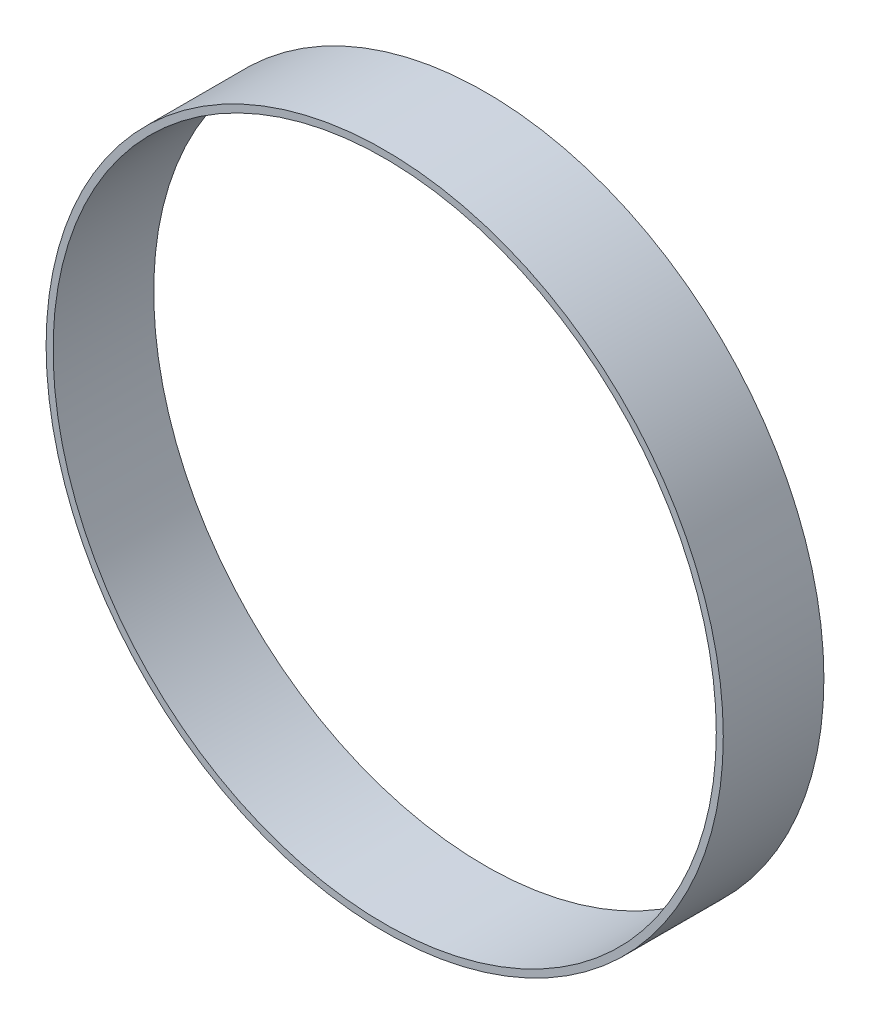
ISO-10303-21;
HEADER;
FILE_DESCRIPTION(('STEP AP214'),'2;1');
FILE_NAME('part.step','',(''),(''),'','','');
FILE_SCHEMA(('AUTOMOTIVE_DESIGN { 1 0 10303 214 1 1 1 1 }'));
ENDSEC;
DATA;
#1=APPLICATION_CONTEXT('core data for automotive mechanical design processes');
#2=APPLICATION_PROTOCOL_DEFINITION('international standard','automotive_design',2000,#1);
#3=PRODUCT_CONTEXT('',#1,'mechanical');
#4=PRODUCT('Part','Part','',(#3));
#5=PRODUCT_RELATED_PRODUCT_CATEGORY('part','',(#4));
#6=PRODUCT_DEFINITION_FORMATION('','',#4);
#7=PRODUCT_DEFINITION_CONTEXT('part definition',#1,'design');
#8=PRODUCT_DEFINITION('design','',#6,#7);
#9=PRODUCT_DEFINITION_SHAPE('','',#8);
#10=(LENGTH_UNIT() NAMED_UNIT(*) SI_UNIT(.MILLI.,.METRE.));
#11=(NAMED_UNIT(*) PLANE_ANGLE_UNIT() SI_UNIT($,.RADIAN.));
#12=(NAMED_UNIT(*) SI_UNIT($,.STERADIAN.) SOLID_ANGLE_UNIT());
#13=UNCERTAINTY_MEASURE_WITH_UNIT(LENGTH_MEASURE(1.E-05),#10,'distance_accuracy_value','');
#14=(GEOMETRIC_REPRESENTATION_CONTEXT(3) GLOBAL_UNCERTAINTY_ASSIGNED_CONTEXT((#13)) GLOBAL_UNIT_ASSIGNED_CONTEXT((#10,
#11,#12)) REPRESENTATION_CONTEXT('',''));
#15=CARTESIAN_POINT('',(0.,0.,0.));
#16=DIRECTION('',(0.,0.,1.));
#17=DIRECTION('',(1.,0.,0.));
#18=AXIS2_PLACEMENT_3D('',#15,#16,#17);
#19=CARTESIAN_POINT('',(0.,0.,11.5));
#20=DIRECTION('',(0.,0.,1.));
#21=DIRECTION('',(1.,0.,0.));
#22=AXIS2_PLACEMENT_3D('',#19,#20,#21);
#23=PLANE('',#22);
#24=CARTESIAN_POINT('',(0.,0.,11.5));
#25=DIRECTION('',(0.,0.,1.));
#26=DIRECTION('',(1.,0.,0.));
#27=AXIS2_PLACEMENT_3D('',#24,#25,#26);
#28=CIRCLE('',#27,38.7);
#29=CARTESIAN_POINT('',(38.7,0.,11.5));
#30=VERTEX_POINT('',#29);
#31=EDGE_CURVE('E10',#30,#30,#28,.T.);
#32=ORIENTED_EDGE('',*,*,#31,.T.);
#33=EDGE_LOOP('',(#32));
#34=FACE_BOUND('',#33,.T.);
#35=CARTESIAN_POINT('',(0.,0.,11.5));
#36=DIRECTION('',(0.,0.,1.));
#37=DIRECTION('',(1.,0.,0.));
#38=AXIS2_PLACEMENT_3D('',#35,#36,#37);
#39=CIRCLE('',#38,37.9);
#40=CARTESIAN_POINT('',(37.9,0.,11.5));
#41=VERTEX_POINT('',#40);
#42=EDGE_CURVE('E43',#41,#41,#39,.T.);
#43=ORIENTED_EDGE('',*,*,#42,.F.);
#44=EDGE_LOOP('',(#43));
#45=FACE_BOUND('',#44,.T.);
#46=ADVANCED_FACE('F32',(#34,#45),#23,.T.);
#47=CARTESIAN_POINT('',(0.,0.,0.));
#48=DIRECTION('',(0.,0.,1.));
#49=DIRECTION('',(1.,0.,0.));
#50=AXIS2_PLACEMENT_3D('',#47,#48,#49);
#51=PLANE('',#50);
#52=CARTESIAN_POINT('',(0.,0.,0.));
#53=DIRECTION('',(0.,0.,1.));
#54=DIRECTION('',(1.,0.,0.));
#55=AXIS2_PLACEMENT_3D('',#52,#53,#54);
#56=CIRCLE('',#55,38.7);
#57=CARTESIAN_POINT('',(38.7,0.,0.));
#58=VERTEX_POINT('',#57);
#59=EDGE_CURVE('E36',#58,#58,#56,.T.);
#60=ORIENTED_EDGE('',*,*,#59,.F.);
#61=EDGE_LOOP('',(#60));
#62=FACE_BOUND('',#61,.T.);
#63=CARTESIAN_POINT('',(0.,0.,0.));
#64=DIRECTION('',(0.,0.,1.));
#65=DIRECTION('',(1.,0.,0.));
#66=AXIS2_PLACEMENT_3D('',#63,#64,#65);
#67=CIRCLE('',#66,37.9);
#68=CARTESIAN_POINT('',(37.9,0.,0.));
#69=VERTEX_POINT('',#68);
#70=EDGE_CURVE('E45',#69,#69,#67,.T.);
#71=ORIENTED_EDGE('',*,*,#70,.T.);
#72=EDGE_LOOP('',(#71));
#73=FACE_BOUND('',#72,.T.);
#74=ADVANCED_FACE('F55',(#62,#73),#51,.F.);
#75=CARTESIAN_POINT('',(0.,0.,11.5));
#76=DIRECTION('',(0.,0.,-1.));
#77=DIRECTION('',(-1.,0.,0.));
#78=AXIS2_PLACEMENT_3D('',#75,#76,#77);
#79=CYLINDRICAL_SURFACE('',#78,38.7);
#80=ORIENTED_EDGE('',*,*,#31,.F.);
#81=EDGE_LOOP('',(#80));
#82=FACE_BOUND('',#81,.T.);
#83=ORIENTED_EDGE('',*,*,#59,.T.);
#84=EDGE_LOOP('',(#83));
#85=FACE_BOUND('',#84,.T.);
#86=ADVANCED_FACE('F34',(#82,#85),#79,.T.);
#87=CARTESIAN_POINT('',(0.,0.,11.5));
#88=DIRECTION('',(0.,0.,-1.));
#89=DIRECTION('',(-1.,0.,0.));
#90=AXIS2_PLACEMENT_3D('',#87,#88,#89);
#91=CYLINDRICAL_SURFACE('',#90,37.9);
#92=ORIENTED_EDGE('',*,*,#42,.T.);
#93=EDGE_LOOP('',(#92));
#94=FACE_BOUND('',#93,.T.);
#95=ORIENTED_EDGE('',*,*,#70,.F.);
#96=EDGE_LOOP('',(#95));
#97=FACE_BOUND('',#96,.T.);
#98=ADVANCED_FACE('F51',(#94,#97),#91,.F.);
#99=CLOSED_SHELL('',(#46,#74,#86,#98));
#100=MANIFOLD_SOLID_BREP('B2',#99);
#101=ADVANCED_BREP_SHAPE_REPRESENTATION('',(#18,#100),#14);
#102=SHAPE_DEFINITION_REPRESENTATION(#9,#101);
ENDSEC;
END-ISO-10303-21;
